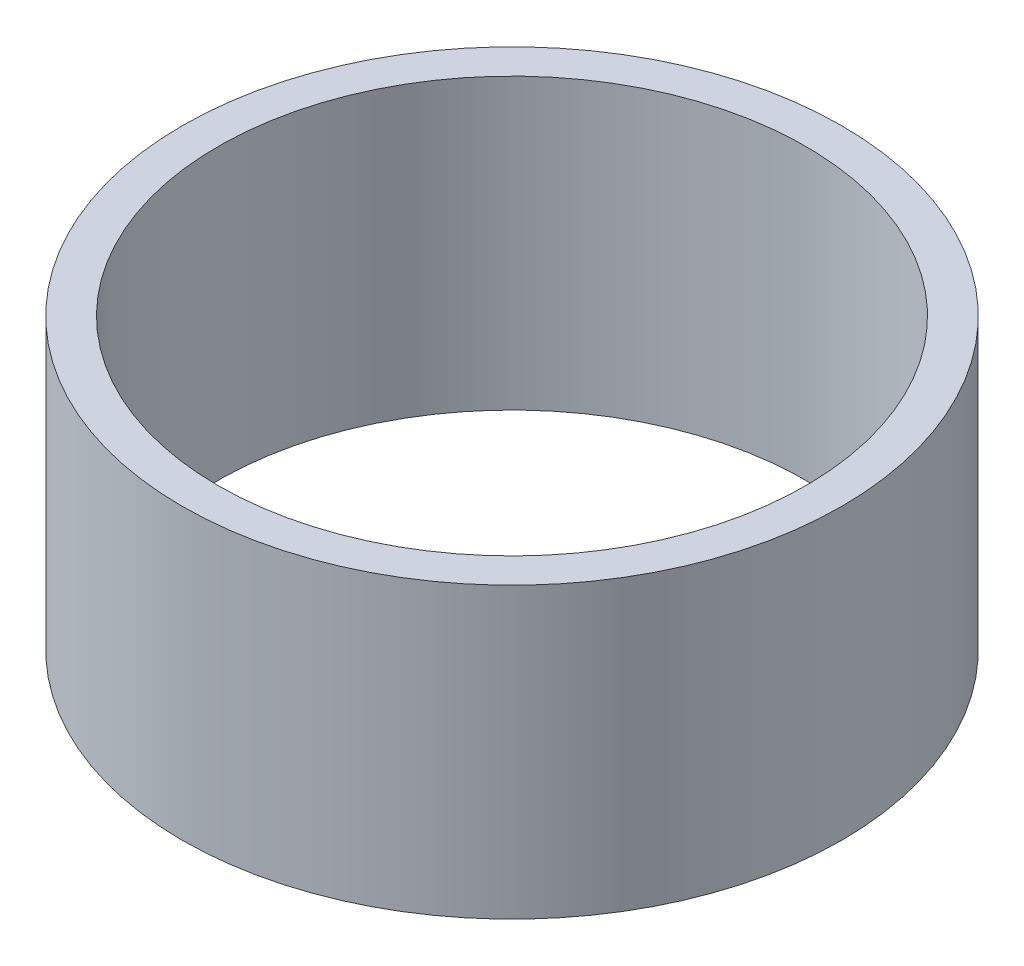
ISO-10303-21;
HEADER;
FILE_DESCRIPTION(('STEP AP214'),'2;1');
FILE_NAME('part.step','',(''),(''),'','','');
FILE_SCHEMA(('AUTOMOTIVE_DESIGN { 1 0 10303 214 1 1 1 1 }'));
ENDSEC;
DATA;
#1=APPLICATION_CONTEXT('core data for automotive mechanical design processes');
#2=APPLICATION_PROTOCOL_DEFINITION('international standard','automotive_design',2000,#1);
#3=PRODUCT_CONTEXT('',#1,'mechanical');
#4=PRODUCT('Part','Part','',(#3));
#5=PRODUCT_RELATED_PRODUCT_CATEGORY('part','',(#4));
#6=PRODUCT_DEFINITION_FORMATION('','',#4);
#7=PRODUCT_DEFINITION_CONTEXT('part definition',#1,'design');
#8=PRODUCT_DEFINITION('design','',#6,#7);
#9=PRODUCT_DEFINITION_SHAPE('','',#8);
#10=(LENGTH_UNIT() NAMED_UNIT(*) SI_UNIT(.MILLI.,.METRE.));
#11=(NAMED_UNIT(*) PLANE_ANGLE_UNIT() SI_UNIT($,.RADIAN.));
#12=(NAMED_UNIT(*) SI_UNIT($,.STERADIAN.) SOLID_ANGLE_UNIT());
#13=UNCERTAINTY_MEASURE_WITH_UNIT(LENGTH_MEASURE(1.E-05),#10,'distance_accuracy_value','');
#14=(GEOMETRIC_REPRESENTATION_CONTEXT(3) GLOBAL_UNCERTAINTY_ASSIGNED_CONTEXT((#13)) GLOBAL_UNIT_ASSIGNED_CONTEXT((#10,
#11,#12)) REPRESENTATION_CONTEXT('',''));
#15=CARTESIAN_POINT('',(0.,0.,0.));
#16=DIRECTION('',(0.,0.,1.));
#17=DIRECTION('',(1.,0.,0.));
#18=AXIS2_PLACEMENT_3D('',#15,#16,#17);
#19=CARTESIAN_POINT('',(0.,12.5,0.));
#20=DIRECTION('',(0.,1.,0.));
#21=DIRECTION('',(0.,0.,1.));
#22=AXIS2_PLACEMENT_3D('',#19,#20,#21);
#23=PLANE('',#22);
#24=CARTESIAN_POINT('',(0.,12.5,0.));
#25=DIRECTION('',(0.,1.,0.));
#26=DIRECTION('',(0.,0.,1.));
#27=AXIS2_PLACEMENT_3D('',#24,#25,#26);
#28=CIRCLE('',#27,14.25);
#29=CARTESIAN_POINT('',(0.,12.5,14.25));
#30=VERTEX_POINT('',#29);
#31=EDGE_CURVE('E10',#30,#30,#28,.T.);
#32=ORIENTED_EDGE('',*,*,#31,.T.);
#33=EDGE_LOOP('',(#32));
#34=FACE_BOUND('',#33,.T.);
#35=CARTESIAN_POINT('',(0.,12.5,0.));
#36=DIRECTION('',(0.,1.,0.));
#37=DIRECTION('',(0.,0.,1.));
#38=AXIS2_PLACEMENT_3D('',#35,#36,#37);
#39=CIRCLE('',#38,12.7);
#40=CARTESIAN_POINT('',(0.,12.5,12.7));
#41=VERTEX_POINT('',#40);
#42=EDGE_CURVE('E42',#41,#41,#39,.T.);
#43=ORIENTED_EDGE('',*,*,#42,.F.);
#44=EDGE_LOOP('',(#43));
#45=FACE_BOUND('',#44,.T.);
#46=ADVANCED_FACE('F31',(#34,#45),#23,.T.);
#47=CARTESIAN_POINT('',(0.,0.,0.));
#48=DIRECTION('',(0.,1.,0.));
#49=DIRECTION('',(0.,0.,1.));
#50=AXIS2_PLACEMENT_3D('',#47,#48,#49);
#51=PLANE('',#50);
#52=CARTESIAN_POINT('',(0.,0.,0.));
#53=DIRECTION('',(0.,1.,0.));
#54=DIRECTION('',(0.,0.,1.));
#55=AXIS2_PLACEMENT_3D('',#52,#53,#54);
#56=CIRCLE('',#55,14.25);
#57=CARTESIAN_POINT('',(0.,0.,14.25));
#58=VERTEX_POINT('',#57);
#59=EDGE_CURVE('E35',#58,#58,#56,.T.);
#60=ORIENTED_EDGE('',*,*,#59,.F.);
#61=EDGE_LOOP('',(#60));
#62=FACE_BOUND('',#61,.T.);
#63=CARTESIAN_POINT('',(0.,0.,0.));
#64=DIRECTION('',(0.,1.,0.));
#65=DIRECTION('',(0.,0.,1.));
#66=AXIS2_PLACEMENT_3D('',#63,#64,#65);
#67=CIRCLE('',#66,12.7);
#68=CARTESIAN_POINT('',(0.,0.,12.7));
#69=VERTEX_POINT('',#68);
#70=EDGE_CURVE('E44',#69,#69,#67,.T.);
#71=ORIENTED_EDGE('',*,*,#70,.T.);
#72=EDGE_LOOP('',(#71));
#73=FACE_BOUND('',#72,.T.);
#74=ADVANCED_FACE('F54',(#62,#73),#51,.F.);
#75=CARTESIAN_POINT('',(0.,12.5,0.));
#76=DIRECTION('',(0.,-1.,0.));
#77=DIRECTION('',(0.,0.,-1.));
#78=AXIS2_PLACEMENT_3D('',#75,#76,#77);
#79=CYLINDRICAL_SURFACE('',#78,14.25);
#80=ORIENTED_EDGE('',*,*,#31,.F.);
#81=EDGE_LOOP('',(#80));
#82=FACE_BOUND('',#81,.T.);
#83=ORIENTED_EDGE('',*,*,#59,.T.);
#84=EDGE_LOOP('',(#83));
#85=FACE_BOUND('',#84,.T.);
#86=ADVANCED_FACE('F33',(#82,#85),#79,.T.);
#87=CARTESIAN_POINT('',(0.,12.5,0.));
#88=DIRECTION('',(0.,-1.,0.));
#89=DIRECTION('',(0.,0.,-1.));
#90=AXIS2_PLACEMENT_3D('',#87,#88,#89);
#91=CYLINDRICAL_SURFACE('',#90,12.7);
#92=ORIENTED_EDGE('',*,*,#42,.T.);
#93=EDGE_LOOP('',(#92));
#94=FACE_BOUND('',#93,.T.);
#95=ORIENTED_EDGE('',*,*,#70,.F.);
#96=EDGE_LOOP('',(#95));
#97=FACE_BOUND('',#96,.T.);
#98=ADVANCED_FACE('F50',(#94,#97),#91,.F.);
#99=CLOSED_SHELL('',(#46,#74,#86,#98));
#100=MANIFOLD_SOLID_BREP('B2',#99);
#101=ADVANCED_BREP_SHAPE_REPRESENTATION('',(#18,#100),#14);
#102=SHAPE_DEFINITION_REPRESENTATION(#9,#101);
ENDSEC;
END-ISO-10303-21;
